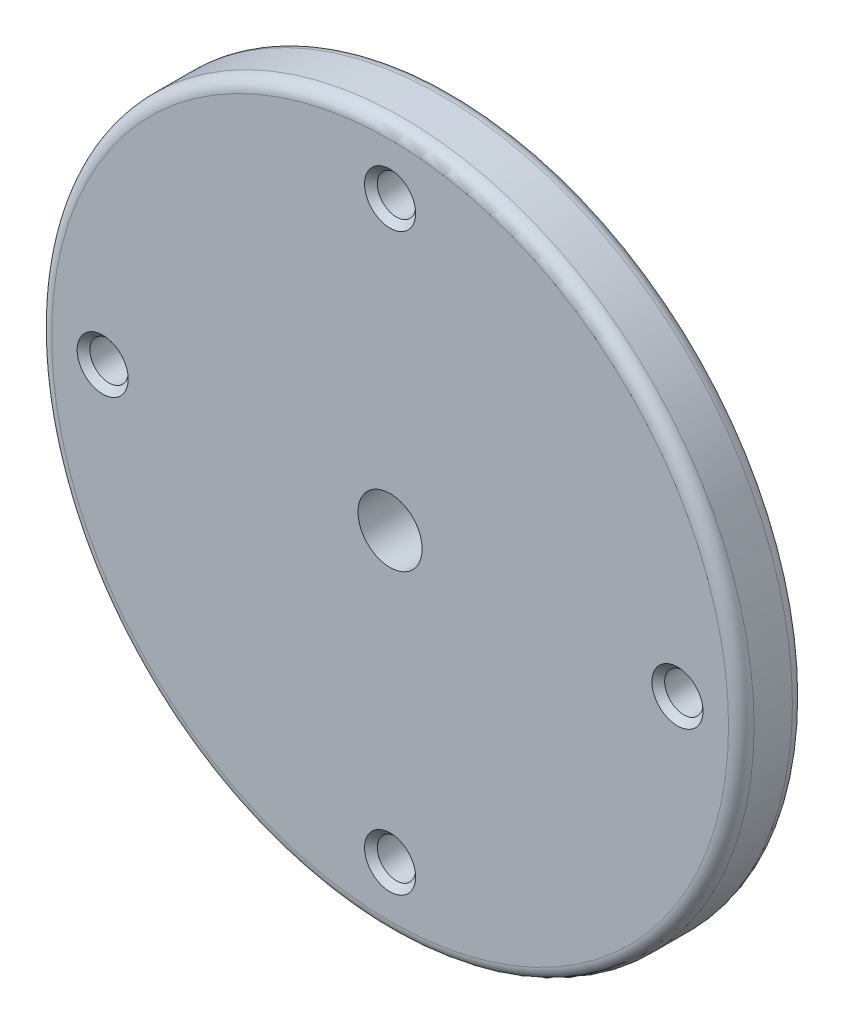
ISO-10303-21;
HEADER;
FILE_DESCRIPTION(('STEP AP214'),'2;1');
FILE_NAME('part.step','',(''),(''),'','','');
FILE_SCHEMA(('AUTOMOTIVE_DESIGN { 1 0 10303 214 1 1 1 1 }'));
ENDSEC;
DATA;
#1=APPLICATION_CONTEXT('core data for automotive mechanical design processes');
#2=APPLICATION_PROTOCOL_DEFINITION('international standard','automotive_design',2000,#1);
#3=PRODUCT_CONTEXT('',#1,'mechanical');
#4=PRODUCT('Part','Part','',(#3));
#5=PRODUCT_RELATED_PRODUCT_CATEGORY('part','',(#4));
#6=PRODUCT_DEFINITION_FORMATION('','',#4);
#7=PRODUCT_DEFINITION_CONTEXT('part definition',#1,'design');
#8=PRODUCT_DEFINITION('design','',#6,#7);
#9=PRODUCT_DEFINITION_SHAPE('','',#8);
#10=(LENGTH_UNIT() NAMED_UNIT(*) SI_UNIT(.MILLI.,.METRE.));
#11=(NAMED_UNIT(*) PLANE_ANGLE_UNIT() SI_UNIT($,.RADIAN.));
#12=(NAMED_UNIT(*) SI_UNIT($,.STERADIAN.) SOLID_ANGLE_UNIT());
#13=UNCERTAINTY_MEASURE_WITH_UNIT(LENGTH_MEASURE(1.E-05),#10,'distance_accuracy_value','');
#14=(GEOMETRIC_REPRESENTATION_CONTEXT(3) GLOBAL_UNCERTAINTY_ASSIGNED_CONTEXT((#13)) GLOBAL_UNIT_ASSIGNED_CONTEXT((#10,
#11,#12)) REPRESENTATION_CONTEXT('',''));
#15=CARTESIAN_POINT('',(0.,0.,0.));
#16=DIRECTION('',(0.,0.,1.));
#17=DIRECTION('',(1.,0.,0.));
#18=AXIS2_PLACEMENT_3D('',#15,#16,#17);
#19=CARTESIAN_POINT('',(0.,0.,5.));
#20=DIRECTION('',(0.,0.,-1.));
#21=DIRECTION('',(-1.,0.,0.));
#22=AXIS2_PLACEMENT_3D('',#19,#20,#21);
#23=CYLINDRICAL_SURFACE('',#22,27.5);
#24=CARTESIAN_POINT('',(0.,0.,4.));
#25=DIRECTION('',(0.,0.,1.));
#26=DIRECTION('',(1.,0.,0.));
#27=AXIS2_PLACEMENT_3D('',#24,#25,#26);
#28=CIRCLE('',#27,27.5);
#29=CARTESIAN_POINT('',(27.5,0.,4.));
#30=VERTEX_POINT('',#29);
#31=EDGE_CURVE('E88',#30,#30,#28,.F.);
#32=ORIENTED_EDGE('',*,*,#31,.T.);
#33=EDGE_LOOP('',(#32));
#34=FACE_BOUND('',#33,.T.);
#35=CARTESIAN_POINT('',(0.,0.,1.));
#36=DIRECTION('',(0.,0.,1.));
#37=DIRECTION('',(1.,0.,0.));
#38=AXIS2_PLACEMENT_3D('',#35,#36,#37);
#39=CIRCLE('',#38,27.5);
#40=CARTESIAN_POINT('',(27.5,0.,1.));
#41=VERTEX_POINT('',#40);
#42=EDGE_CURVE('E92',#41,#41,#39,.T.);
#43=ORIENTED_EDGE('',*,*,#42,.T.);
#44=EDGE_LOOP('',(#43));
#45=FACE_BOUND('',#44,.T.);
#46=ADVANCED_FACE('F43',(#34,#45),#23,.T.);
#47=CARTESIAN_POINT('',(1.27384319559115E-12,-22.5,5.));
#48=DIRECTION('',(0.,0.,-1.));
#49=DIRECTION('',(-1.,0.,0.));
#50=AXIS2_PLACEMENT_3D('',#47,#48,#49);
#51=CYLINDRICAL_SURFACE('',#50,1.5);
#52=CARTESIAN_POINT('',(1.27384319559115E-12,-22.5,4.5));
#53=DIRECTION('',(0.,0.,1.));
#54=DIRECTION('',(1.,0.,0.));
#55=AXIS2_PLACEMENT_3D('',#52,#53,#54);
#56=CIRCLE('',#55,1.5);
#57=CARTESIAN_POINT('',(1.50000000000127,-22.5,4.5));
#58=VERTEX_POINT('',#57);
#59=EDGE_CURVE('E57',#58,#58,#56,.T.);
#60=ORIENTED_EDGE('',*,*,#59,.T.);
#61=EDGE_LOOP('',(#60));
#62=FACE_BOUND('',#61,.T.);
#63=CARTESIAN_POINT('',(1.27384319559115E-12,-22.5,0.));
#64=DIRECTION('',(0.,0.,1.));
#65=DIRECTION('',(1.,0.,0.));
#66=AXIS2_PLACEMENT_3D('',#63,#64,#65);
#67=CIRCLE('',#66,1.5);
#68=CARTESIAN_POINT('',(1.50000000000127,-22.5,0.));
#69=VERTEX_POINT('',#68);
#70=EDGE_CURVE('E105',#69,#69,#67,.T.);
#71=ORIENTED_EDGE('',*,*,#70,.F.);
#72=EDGE_LOOP('',(#71));
#73=FACE_BOUND('',#72,.T.);
#74=ADVANCED_FACE('F145',(#62,#73),#51,.F.);
#75=CARTESIAN_POINT('',(0.,0.,5.));
#76=DIRECTION('',(0.,0.,-1.));
#77=DIRECTION('',(-1.,0.,0.));
#78=AXIS2_PLACEMENT_3D('',#75,#76,#77);
#79=CYLINDRICAL_SURFACE('',#78,2.51);
#80=CARTESIAN_POINT('',(0.,0.,5.));
#81=DIRECTION('',(0.,0.,1.));
#82=DIRECTION('',(1.,0.,0.));
#83=AXIS2_PLACEMENT_3D('',#80,#81,#82);
#84=CIRCLE('',#83,2.51);
#85=CARTESIAN_POINT('',(2.51,0.,5.));
#86=VERTEX_POINT('',#85);
#87=EDGE_CURVE('E100',#86,#86,#84,.T.);
#88=ORIENTED_EDGE('',*,*,#87,.T.);
#89=EDGE_LOOP('',(#88));
#90=FACE_BOUND('',#89,.T.);
#91=CARTESIAN_POINT('',(0.,0.,0.));
#92=DIRECTION('',(0.,0.,1.));
#93=DIRECTION('',(1.,0.,0.));
#94=AXIS2_PLACEMENT_3D('',#91,#92,#93);
#95=CIRCLE('',#94,2.51);
#96=CARTESIAN_POINT('',(2.51,0.,0.));
#97=VERTEX_POINT('',#96);
#98=EDGE_CURVE('E109',#97,#97,#95,.T.);
#99=ORIENTED_EDGE('',*,*,#98,.F.);
#100=EDGE_LOOP('',(#99));
#101=FACE_BOUND('',#100,.T.);
#102=ADVANCED_FACE('F125',(#90,#101),#79,.F.);
#103=CARTESIAN_POINT('',(22.5,0.,5.));
#104=DIRECTION('',(0.,0.,-1.));
#105=DIRECTION('',(-1.,0.,0.));
#106=AXIS2_PLACEMENT_3D('',#103,#104,#105);
#107=CYLINDRICAL_SURFACE('',#106,1.5);
#108=CARTESIAN_POINT('',(22.5,0.,4.5));
#109=DIRECTION('',(0.,0.,1.));
#110=DIRECTION('',(1.,0.,0.));
#111=AXIS2_PLACEMENT_3D('',#108,#109,#110);
#112=CIRCLE('',#111,1.5);
#113=CARTESIAN_POINT('',(24.,0.,4.5));
#114=VERTEX_POINT('',#113);
#115=EDGE_CURVE('E80',#114,#114,#112,.T.);
#116=ORIENTED_EDGE('',*,*,#115,.T.);
#117=EDGE_LOOP('',(#116));
#118=FACE_BOUND('',#117,.T.);
#119=CARTESIAN_POINT('',(22.5,0.,0.));
#120=DIRECTION('',(0.,0.,1.));
#121=DIRECTION('',(1.,0.,0.));
#122=AXIS2_PLACEMENT_3D('',#119,#120,#121);
#123=CIRCLE('',#122,1.5);
#124=CARTESIAN_POINT('',(24.,0.,0.));
#125=VERTEX_POINT('',#124);
#126=EDGE_CURVE('E113',#125,#125,#123,.T.);
#127=ORIENTED_EDGE('',*,*,#126,.F.);
#128=EDGE_LOOP('',(#127));
#129=FACE_BOUND('',#128,.T.);
#130=ADVANCED_FACE('F157',(#118,#129),#107,.F.);
#131=CARTESIAN_POINT('',(0.,22.5,5.));
#132=DIRECTION('',(0.,0.,-1.));
#133=DIRECTION('',(-1.,0.,0.));
#134=AXIS2_PLACEMENT_3D('',#131,#132,#133);
#135=CYLINDRICAL_SURFACE('',#134,1.5);
#136=CARTESIAN_POINT('',(0.,22.5,4.5));
#137=DIRECTION('',(0.,0.,1.));
#138=DIRECTION('',(1.,0.,0.));
#139=AXIS2_PLACEMENT_3D('',#136,#137,#138);
#140=CIRCLE('',#139,1.5);
#141=CARTESIAN_POINT('',(1.5,22.5,4.5));
#142=VERTEX_POINT('',#141);
#143=EDGE_CURVE('E10',#142,#142,#140,.T.);
#144=ORIENTED_EDGE('',*,*,#143,.T.);
#145=EDGE_LOOP('',(#144));
#146=FACE_BOUND('',#145,.T.);
#147=CARTESIAN_POINT('',(0.,22.5,0.));
#148=DIRECTION('',(0.,0.,1.));
#149=DIRECTION('',(1.,0.,0.));
#150=AXIS2_PLACEMENT_3D('',#147,#148,#149);
#151=CIRCLE('',#150,1.5);
#152=CARTESIAN_POINT('',(1.5,22.5,0.));
#153=VERTEX_POINT('',#152);
#154=EDGE_CURVE('E117',#153,#153,#151,.T.);
#155=ORIENTED_EDGE('',*,*,#154,.F.);
#156=EDGE_LOOP('',(#155));
#157=FACE_BOUND('',#156,.T.);
#158=ADVANCED_FACE('F141',(#146,#157),#135,.F.);
#159=CARTESIAN_POINT('',(-22.4999999999994,-6.38110734535049E-13,5.));
#160=DIRECTION('',(0.,0.,-1.));
#161=DIRECTION('',(-1.,0.,0.));
#162=AXIS2_PLACEMENT_3D('',#159,#160,#161);
#163=CYLINDRICAL_SURFACE('',#162,1.5);
#164=CARTESIAN_POINT('',(-22.4999999999994,-6.38110734535049E-13,4.5));
#165=DIRECTION('',(0.,0.,1.));
#166=DIRECTION('',(1.,0.,0.));
#167=AXIS2_PLACEMENT_3D('',#164,#165,#166);
#168=CIRCLE('',#167,1.5);
#169=CARTESIAN_POINT('',(-20.9999999999994,-6.38110734535049E-13,4.5));
#170=VERTEX_POINT('',#169);
#171=EDGE_CURVE('E52',#170,#170,#168,.T.);
#172=ORIENTED_EDGE('',*,*,#171,.T.);
#173=EDGE_LOOP('',(#172));
#174=FACE_BOUND('',#173,.T.);
#175=CARTESIAN_POINT('',(-22.4999999999994,-6.38110734535049E-13,0.));
#176=DIRECTION('',(0.,0.,1.));
#177=DIRECTION('',(1.,0.,0.));
#178=AXIS2_PLACEMENT_3D('',#175,#176,#177);
#179=CIRCLE('',#178,1.5);
#180=CARTESIAN_POINT('',(-20.9999999999994,-6.38110734535049E-13,0.));
#181=VERTEX_POINT('',#180);
#182=EDGE_CURVE('E101',#181,#181,#179,.T.);
#183=ORIENTED_EDGE('',*,*,#182,.F.);
#184=EDGE_LOOP('',(#183));
#185=FACE_BOUND('',#184,.T.);
#186=ADVANCED_FACE('F131',(#174,#185),#163,.F.);
#187=CARTESIAN_POINT('',(0.,0.,5.));
#188=DIRECTION('',(0.,0.,1.));
#189=DIRECTION('',(1.,0.,0.));
#190=AXIS2_PLACEMENT_3D('',#187,#188,#189);
#191=PLANE('',#190);
#192=CARTESIAN_POINT('',(22.5,0.,5.));
#193=DIRECTION('',(0.,0.,1.));
#194=DIRECTION('',(1.,0.,0.));
#195=AXIS2_PLACEMENT_3D('',#192,#193,#194);
#196=CIRCLE('',#195,1.99999999999999);
#197=CARTESIAN_POINT('',(24.5,0.,5.));
#198=VERTEX_POINT('',#197);
#199=EDGE_CURVE('E62',#198,#198,#196,.F.);
#200=ORIENTED_EDGE('',*,*,#199,.T.);
#201=EDGE_LOOP('',(#200));
#202=FACE_BOUND('',#201,.T.);
#203=CARTESIAN_POINT('',(1.27384319559115E-12,-22.5,5.));
#204=DIRECTION('',(0.,0.,1.));
#205=DIRECTION('',(1.,0.,0.));
#206=AXIS2_PLACEMENT_3D('',#203,#204,#205);
#207=CIRCLE('',#206,1.99999999999999);
#208=CARTESIAN_POINT('',(2.00000000000127,-22.5,5.));
#209=VERTEX_POINT('',#208);
#210=EDGE_CURVE('E68',#209,#209,#207,.F.);
#211=ORIENTED_EDGE('',*,*,#210,.T.);
#212=EDGE_LOOP('',(#211));
#213=FACE_BOUND('',#212,.T.);
#214=CARTESIAN_POINT('',(-22.4999999999994,-6.38110734535049E-13,5.));
#215=DIRECTION('',(0.,0.,1.));
#216=DIRECTION('',(1.,0.,0.));
#217=AXIS2_PLACEMENT_3D('',#214,#215,#216);
#218=CIRCLE('',#217,1.99999999999999);
#219=CARTESIAN_POINT('',(-20.4999999999994,-6.38110734535049E-13,5.));
#220=VERTEX_POINT('',#219);
#221=EDGE_CURVE('E72',#220,#220,#218,.F.);
#222=ORIENTED_EDGE('',*,*,#221,.T.);
#223=EDGE_LOOP('',(#222));
#224=FACE_BOUND('',#223,.T.);
#225=CARTESIAN_POINT('',(0.,22.5,5.));
#226=DIRECTION('',(0.,0.,1.));
#227=DIRECTION('',(1.,0.,0.));
#228=AXIS2_PLACEMENT_3D('',#225,#226,#227);
#229=CIRCLE('',#228,1.99999999999999);
#230=CARTESIAN_POINT('',(2.,22.5,5.));
#231=VERTEX_POINT('',#230);
#232=EDGE_CURVE('E76',#231,#231,#229,.F.);
#233=ORIENTED_EDGE('',*,*,#232,.T.);
#234=EDGE_LOOP('',(#233));
#235=FACE_BOUND('',#234,.T.);
#236=CARTESIAN_POINT('',(0.,0.,5.));
#237=DIRECTION('',(0.,0.,1.));
#238=DIRECTION('',(1.,0.,0.));
#239=AXIS2_PLACEMENT_3D('',#236,#237,#238);
#240=CIRCLE('',#239,26.5);
#241=CARTESIAN_POINT('',(26.5,0.,5.));
#242=VERTEX_POINT('',#241);
#243=EDGE_CURVE('E96',#242,#242,#240,.T.);
#244=ORIENTED_EDGE('',*,*,#243,.T.);
#245=EDGE_LOOP('',(#244));
#246=FACE_BOUND('',#245,.T.);
#247=ORIENTED_EDGE('',*,*,#87,.F.);
#248=EDGE_LOOP('',(#247));
#249=FACE_BOUND('',#248,.T.);
#250=ADVANCED_FACE('F128',(#202,#213,#224,#235,#246,#249),#191,.T.);
#251=CARTESIAN_POINT('',(0.,0.,0.));
#252=DIRECTION('',(0.,0.,1.));
#253=DIRECTION('',(1.,0.,0.));
#254=AXIS2_PLACEMENT_3D('',#251,#252,#253);
#255=PLANE('',#254);
#256=CARTESIAN_POINT('',(0.,0.,0.));
#257=DIRECTION('',(0.,0.,1.));
#258=DIRECTION('',(1.,0.,0.));
#259=AXIS2_PLACEMENT_3D('',#256,#257,#258);
#260=CIRCLE('',#259,26.5);
#261=CARTESIAN_POINT('',(26.5,0.,0.));
#262=VERTEX_POINT('',#261);
#263=EDGE_CURVE('E84',#262,#262,#260,.F.);
#264=ORIENTED_EDGE('',*,*,#263,.T.);
#265=EDGE_LOOP('',(#264));
#266=FACE_BOUND('',#265,.T.);
#267=ORIENTED_EDGE('',*,*,#154,.T.);
#268=EDGE_LOOP('',(#267));
#269=FACE_BOUND('',#268,.T.);
#270=ORIENTED_EDGE('',*,*,#126,.T.);
#271=EDGE_LOOP('',(#270));
#272=FACE_BOUND('',#271,.T.);
#273=ORIENTED_EDGE('',*,*,#98,.T.);
#274=EDGE_LOOP('',(#273));
#275=FACE_BOUND('',#274,.T.);
#276=ORIENTED_EDGE('',*,*,#70,.T.);
#277=EDGE_LOOP('',(#276));
#278=FACE_BOUND('',#277,.T.);
#279=ORIENTED_EDGE('',*,*,#182,.T.);
#280=EDGE_LOOP('',(#279));
#281=FACE_BOUND('',#280,.T.);
#282=ADVANCED_FACE('F130',(#266,#269,#272,#275,#278,#281),#255,.F.);
#283=CARTESIAN_POINT('',(0.,0.,4.));
#284=DIRECTION('',(0.,0.,1.));
#285=DIRECTION('',(1.,0.,0.));
#286=AXIS2_PLACEMENT_3D('',#283,#284,#285);
#287=TOROIDAL_SURFACE('',#286,26.5,1.);
#288=ORIENTED_EDGE('',*,*,#31,.F.);
#289=EDGE_LOOP('',(#288));
#290=FACE_BOUND('',#289,.T.);
#291=ORIENTED_EDGE('',*,*,#243,.F.);
#292=EDGE_LOOP('',(#291));
#293=FACE_BOUND('',#292,.T.);
#294=ADVANCED_FACE('F138',(#290,#293),#287,.T.);
#295=CARTESIAN_POINT('',(0.,0.,1.));
#296=DIRECTION('',(0.,0.,1.));
#297=DIRECTION('',(1.,0.,0.));
#298=AXIS2_PLACEMENT_3D('',#295,#296,#297);
#299=TOROIDAL_SURFACE('',#298,26.5,1.);
#300=ORIENTED_EDGE('',*,*,#263,.F.);
#301=EDGE_LOOP('',(#300));
#302=FACE_BOUND('',#301,.T.);
#303=ORIENTED_EDGE('',*,*,#42,.F.);
#304=EDGE_LOOP('',(#303));
#305=FACE_BOUND('',#304,.T.);
#306=ADVANCED_FACE('F165',(#302,#305),#299,.T.);
#307=CARTESIAN_POINT('',(22.5,0.,4.5));
#308=DIRECTION('',(0.,0.,1.));
#309=DIRECTION('',(1.,0.,0.));
#310=AXIS2_PLACEMENT_3D('',#307,#308,#309);
#311=CONICAL_SURFACE('',#310,1.5,0.785398163397443);
#312=ORIENTED_EDGE('',*,*,#199,.F.);
#313=EDGE_LOOP('',(#312));
#314=FACE_BOUND('',#313,.T.);
#315=ORIENTED_EDGE('',*,*,#115,.F.);
#316=EDGE_LOOP('',(#315));
#317=FACE_BOUND('',#316,.T.);
#318=ADVANCED_FACE('F169',(#314,#317),#311,.F.);
#319=CARTESIAN_POINT('',(1.27384319559115E-12,-22.5,4.5));
#320=DIRECTION('',(0.,0.,1.));
#321=DIRECTION('',(1.,0.,0.));
#322=AXIS2_PLACEMENT_3D('',#319,#320,#321);
#323=CONICAL_SURFACE('',#322,1.5,0.785398163397443);
#324=ORIENTED_EDGE('',*,*,#210,.F.);
#325=EDGE_LOOP('',(#324));
#326=FACE_BOUND('',#325,.T.);
#327=ORIENTED_EDGE('',*,*,#59,.F.);
#328=EDGE_LOOP('',(#327));
#329=FACE_BOUND('',#328,.T.);
#330=ADVANCED_FACE('F177',(#326,#329),#323,.F.);
#331=CARTESIAN_POINT('',(-22.4999999999994,-6.38110734535049E-13,4.5));
#332=DIRECTION('',(0.,0.,1.));
#333=DIRECTION('',(1.,0.,0.));
#334=AXIS2_PLACEMENT_3D('',#331,#332,#333);
#335=CONICAL_SURFACE('',#334,1.5,0.785398163397443);
#336=ORIENTED_EDGE('',*,*,#221,.F.);
#337=EDGE_LOOP('',(#336));
#338=FACE_BOUND('',#337,.T.);
#339=ORIENTED_EDGE('',*,*,#171,.F.);
#340=EDGE_LOOP('',(#339));
#341=FACE_BOUND('',#340,.T.);
#342=ADVANCED_FACE('F183',(#338,#341),#335,.F.);
#343=CARTESIAN_POINT('',(0.,22.5,4.5));
#344=DIRECTION('',(0.,0.,1.));
#345=DIRECTION('',(1.,0.,0.));
#346=AXIS2_PLACEMENT_3D('',#343,#344,#345);
#347=CONICAL_SURFACE('',#346,1.5,0.785398163397443);
#348=ORIENTED_EDGE('',*,*,#232,.F.);
#349=EDGE_LOOP('',(#348));
#350=FACE_BOUND('',#349,.T.);
#351=ORIENTED_EDGE('',*,*,#143,.F.);
#352=EDGE_LOOP('',(#351));
#353=FACE_BOUND('',#352,.T.);
#354=ADVANCED_FACE('F46',(#350,#353),#347,.F.);
#355=CLOSED_SHELL('',(#46,#74,#102,#130,#158,#186,#250,#282,#294,#306,#318,#330,#342,#354));
#356=MANIFOLD_SOLID_BREP('B2',#355);
#357=ADVANCED_BREP_SHAPE_REPRESENTATION('',(#18,#356),#14);
#358=SHAPE_DEFINITION_REPRESENTATION(#9,#357);
ENDSEC;
END-ISO-10303-21;
